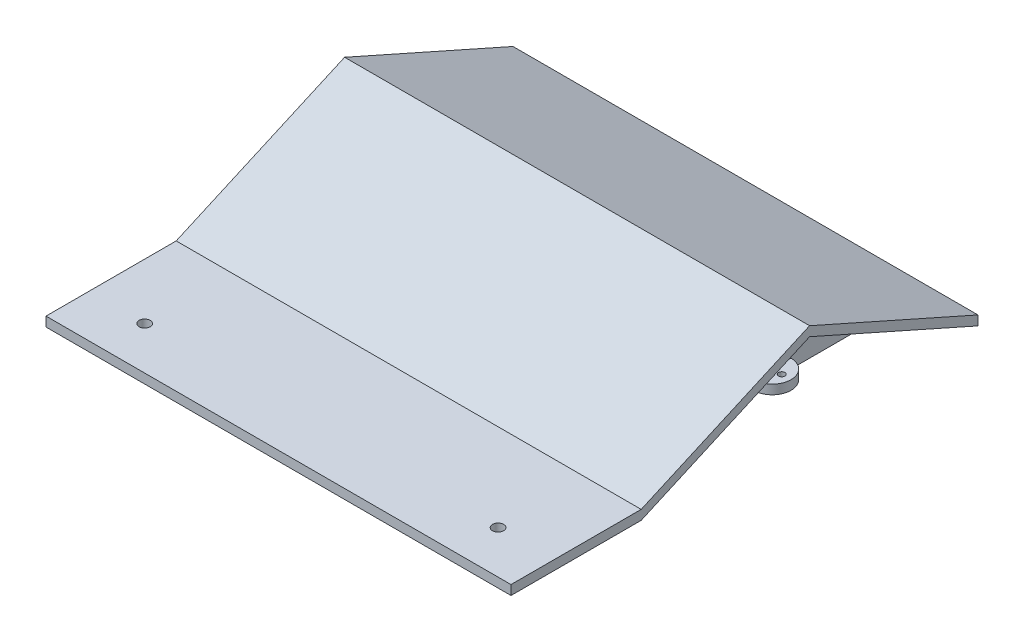
ISO-10303-21;
HEADER;
FILE_DESCRIPTION(('STEP AP214'),'2;1');
FILE_NAME('part.step','',(''),(''),'','','');
FILE_SCHEMA(('AUTOMOTIVE_DESIGN { 1 0 10303 214 1 1 1 1 }'));
ENDSEC;
DATA;
#1=APPLICATION_CONTEXT('core data for automotive mechanical design processes');
#2=APPLICATION_PROTOCOL_DEFINITION('international standard','automotive_design',2000,#1);
#3=PRODUCT_CONTEXT('',#1,'mechanical');
#4=PRODUCT('Part','Part','',(#3));
#5=PRODUCT_RELATED_PRODUCT_CATEGORY('part','',(#4));
#6=PRODUCT_DEFINITION_FORMATION('','',#4);
#7=PRODUCT_DEFINITION_CONTEXT('part definition',#1,'design');
#8=PRODUCT_DEFINITION('design','',#6,#7);
#9=PRODUCT_DEFINITION_SHAPE('','',#8);
#10=(LENGTH_UNIT() NAMED_UNIT(*) SI_UNIT(.MILLI.,.METRE.));
#11=(NAMED_UNIT(*) PLANE_ANGLE_UNIT() SI_UNIT($,.RADIAN.));
#12=(NAMED_UNIT(*) SI_UNIT($,.STERADIAN.) SOLID_ANGLE_UNIT());
#13=UNCERTAINTY_MEASURE_WITH_UNIT(LENGTH_MEASURE(1.E-05),#10,'distance_accuracy_value','');
#14=(GEOMETRIC_REPRESENTATION_CONTEXT(3) GLOBAL_UNCERTAINTY_ASSIGNED_CONTEXT((#13)) GLOBAL_UNIT_ASSIGNED_CONTEXT((#10,
#11,#12)) REPRESENTATION_CONTEXT('',''));
#15=CARTESIAN_POINT('',(0.,0.,0.));
#16=DIRECTION('',(0.,0.,1.));
#17=DIRECTION('',(1.,0.,0.));
#18=AXIS2_PLACEMENT_3D('',#15,#16,#17);
#19=CARTESIAN_POINT('',(-250.,4.27585831422593,1.9003814729893));
#20=DIRECTION('',(0.,-0.913811548620257,-0.406138466053448));
#21=DIRECTION('',(0.,0.406138466053448,-0.913811548620257));
#22=AXIS2_PLACEMENT_3D('',#19,#20,#21);
#23=PLANE('',#22);
#24=DIRECTION('',(0.,0.406138466053448,-0.913811548620257));
#25=VECTOR('',#24,1.);
#26=CARTESIAN_POINT('',(0.,4.27585831422593,1.9003814729893));
#27=LINE('',#26,#25);
#28=CARTESIAN_POINT('',(0.,-5.12047230222117,23.0421253599953));
#29=VERTEX_POINT('',#28);
#30=CARTESIAN_POINT('',(0.,35.1204723022212,-67.5));
#31=VERTEX_POINT('',#30);
#32=EDGE_CURVE('E209',#29,#31,#27,.T.);
#33=ORIENTED_EDGE('',*,*,#32,.T.);
#34=DIRECTION('',(1.,0.,0.));
#35=VECTOR('',#34,1.);
#36=CARTESIAN_POINT('',(-250.,35.1204723022212,-67.5));
#37=LINE('',#36,#35);
#38=CARTESIAN_POINT('',(-250.,35.1204723022212,-67.5));
#39=VERTEX_POINT('',#38);
#40=EDGE_CURVE('E430',#39,#31,#37,.T.);
#41=ORIENTED_EDGE('',*,*,#40,.F.);
#42=DIRECTION('',(0.,0.406138466053448,-0.913811548620257));
#43=VECTOR('',#42,1.);
#44=CARTESIAN_POINT('',(-250.,4.27585831422593,1.9003814729893));
#45=LINE('',#44,#43);
#46=CARTESIAN_POINT('',(-250.,-5.12047230222117,23.0421253599953));
#47=VERTEX_POINT('',#46);
#48=EDGE_CURVE('E400',#47,#39,#45,.T.);
#49=ORIENTED_EDGE('',*,*,#48,.F.);
#50=DIRECTION('',(1.,0.,0.));
#51=VECTOR('',#50,1.);
#52=CARTESIAN_POINT('',(-250.,-5.12047230222117,23.0421253599953));
#53=LINE('',#52,#51);
#54=EDGE_CURVE('E219',#47,#29,#53,.T.);
#55=ORIENTED_EDGE('',*,*,#54,.T.);
#56=EDGE_LOOP('',(#33,#41,#49,#55));
#57=FACE_BOUND('',#56,.T.);
#58=ADVANCED_FACE('F40',(#57),#23,.F.);
#59=CARTESIAN_POINT('',(-250.,54.3789510977311,-24.1684227101027));
#60=DIRECTION('',(0.,0.913811548620257,-0.406138466053448));
#61=DIRECTION('',(0.,0.406138466053448,0.913811548620257));
#62=AXIS2_PLACEMENT_3D('',#59,#60,#61);
#63=PLANE('',#62);
#64=DIRECTION('',(0.,0.406138466053448,0.913811548620257));
#65=VECTOR('',#64,1.);
#66=CARTESIAN_POINT('',(0.,54.3789510977311,-24.1684227101027));
#67=LINE('',#66,#65);
#68=CARTESIAN_POINT('',(0.,-5.12047230222117,-158.042125359995));
#69=VERTEX_POINT('',#68);
#70=EDGE_CURVE('E404',#69,#31,#67,.T.);
#71=ORIENTED_EDGE('',*,*,#70,.F.);
#72=DIRECTION('',(1.,0.,0.));
#73=VECTOR('',#72,1.);
#74=CARTESIAN_POINT('',(-250.,-5.12047230222117,-158.042125359995));
#75=LINE('',#74,#73);
#76=CARTESIAN_POINT('',(-250.,-5.12047230222117,-158.042125359995));
#77=VERTEX_POINT('',#76);
#78=EDGE_CURVE('E434',#77,#69,#75,.T.);
#79=ORIENTED_EDGE('',*,*,#78,.F.);
#80=DIRECTION('',(0.,0.406138466053448,0.913811548620257));
#81=VECTOR('',#80,1.);
#82=CARTESIAN_POINT('',(-250.,54.3789510977311,-24.1684227101027));
#83=LINE('',#82,#81);
#84=EDGE_CURVE('E414',#77,#39,#83,.T.);
#85=ORIENTED_EDGE('',*,*,#84,.T.);
#86=ORIENTED_EDGE('',*,*,#40,.T.);
#87=EDGE_LOOP('',(#71,#79,#85,#86));
#88=FACE_BOUND('',#87,.T.);
#89=ADVANCED_FACE('F497',(#88),#63,.T.);
#90=CARTESIAN_POINT('',(-250.,0.,-158.042125359995));
#91=DIRECTION('',(0.,0.,-1.));
#92=DIRECTION('',(-1.,0.,0.));
#93=AXIS2_PLACEMENT_3D('',#90,#91,#92);
#94=PLANE('',#93);
#95=DIRECTION('',(0.,1.,0.));
#96=VECTOR('',#95,1.);
#97=CARTESIAN_POINT('',(0.,0.,-158.042125359995));
#98=LINE('',#97,#96);
#99=CARTESIAN_POINT('',(0.,-10.2409446044423,-158.042125359995));
#100=VERTEX_POINT('',#99);
#101=EDGE_CURVE('E423',#100,#69,#98,.T.);
#102=ORIENTED_EDGE('',*,*,#101,.F.);
#103=DIRECTION('',(1.,0.,0.));
#104=VECTOR('',#103,1.);
#105=CARTESIAN_POINT('',(-250.,-10.2409446044423,-158.042125359995));
#106=LINE('',#105,#104);
#107=CARTESIAN_POINT('',(-250.,-10.2409446044423,-158.042125359995));
#108=VERTEX_POINT('',#107);
#109=EDGE_CURVE('E437',#108,#100,#106,.T.);
#110=ORIENTED_EDGE('',*,*,#109,.F.);
#111=DIRECTION('',(0.,1.,0.));
#112=VECTOR('',#111,1.);
#113=CARTESIAN_POINT('',(-250.,0.,-158.042125359995));
#114=LINE('',#113,#112);
#115=EDGE_CURVE('E410',#108,#77,#114,.T.);
#116=ORIENTED_EDGE('',*,*,#115,.T.);
#117=ORIENTED_EDGE('',*,*,#78,.T.);
#118=EDGE_LOOP('',(#102,#110,#116,#117));
#119=FACE_BOUND('',#118,.T.);
#120=ADVANCED_FACE('F503',(#119),#94,.T.);
#121=CARTESIAN_POINT('',(-250.,50.1030927835052,-22.2680412371134));
#122=DIRECTION('',(0.,-0.913811548620257,0.406138466053448));
#123=DIRECTION('',(0.,-0.406138466053448,-0.913811548620257));
#124=AXIS2_PLACEMENT_3D('',#121,#122,#123);
#125=PLANE('',#124);
#126=DIRECTION('',(-1.,0.,0.));
#127=VECTOR('',#126,1.);
#128=CARTESIAN_POINT('',(-225.,0.,-135.));
#129=LINE('',#128,#127);
#130=CARTESIAN_POINT('',(-225.,0.,-135.));
#131=VERTEX_POINT('',#130);
#132=CARTESIAN_POINT('',(-230.,0.,-135.));
#133=VERTEX_POINT('',#132);
#134=EDGE_CURVE('E359',#131,#133,#129,.T.);
#135=ORIENTED_EDGE('',*,*,#134,.T.);
#136=DIRECTION('',(-1.,0.,0.));
#137=VECTOR('',#136,1.);
#138=CARTESIAN_POINT('',(-230.,0.,-135.));
#139=LINE('',#138,#137);
#140=CARTESIAN_POINT('',(-250.,0.,-135.));
#141=VERTEX_POINT('',#140);
#142=EDGE_CURVE('E331',#133,#141,#139,.T.);
#143=ORIENTED_EDGE('',*,*,#142,.T.);
#144=DIRECTION('',(0.,-0.406138466053448,-0.913811548620257));
#145=VECTOR('',#144,1.);
#146=CARTESIAN_POINT('',(-250.,50.1030927835052,-22.2680412371134));
#147=LINE('',#146,#145);
#148=EDGE_CURVE('E407',#141,#108,#147,.T.);
#149=ORIENTED_EDGE('',*,*,#148,.T.);
#150=ORIENTED_EDGE('',*,*,#109,.T.);
#151=DIRECTION('',(0.,-0.406138466053448,-0.913811548620257));
#152=VECTOR('',#151,1.);
#153=CARTESIAN_POINT('',(0.,50.1030927835052,-22.2680412371134));
#154=LINE('',#153,#152);
#155=CARTESIAN_POINT('',(0.,29.9999999999999,-67.5));
#156=VERTEX_POINT('',#155);
#157=EDGE_CURVE('E208',#156,#100,#154,.T.);
#158=ORIENTED_EDGE('',*,*,#157,.F.);
#159=DIRECTION('',(1.,0.,0.));
#160=VECTOR('',#159,1.);
#161=CARTESIAN_POINT('',(-20.,29.9999999999999,-67.5));
#162=LINE('',#161,#160);
#163=CARTESIAN_POINT('',(-20.,29.9999999999999,-67.5));
#164=VERTEX_POINT('',#163);
#165=EDGE_CURVE('E203',#164,#156,#162,.T.);
#166=ORIENTED_EDGE('',*,*,#165,.F.);
#167=DIRECTION('',(0.,0.406138466053447,0.913811548620257));
#168=VECTOR('',#167,1.);
#169=CARTESIAN_POINT('',(-20.,0.,-135.));
#170=LINE('',#169,#168);
#171=CARTESIAN_POINT('',(-20.,0.,-135.));
#172=VERTEX_POINT('',#171);
#173=EDGE_CURVE('E374',#172,#164,#170,.T.);
#174=ORIENTED_EDGE('',*,*,#173,.F.);
#175=DIRECTION('',(1.,0.,0.));
#176=VECTOR('',#175,1.);
#177=CARTESIAN_POINT('',(-25.,0.,-135.));
#178=LINE('',#177,#176);
#179=CARTESIAN_POINT('',(-25.,0.,-135.));
#180=VERTEX_POINT('',#179);
#181=EDGE_CURVE('E393',#180,#172,#178,.T.);
#182=ORIENTED_EDGE('',*,*,#181,.F.);
#183=DIRECTION('',(0.,0.406138466053448,0.913811548620257));
#184=VECTOR('',#183,1.);
#185=CARTESIAN_POINT('',(-25.,0.,-135.));
#186=LINE('',#185,#184);
#187=CARTESIAN_POINT('',(-25.,30.,-67.5));
#188=VERTEX_POINT('',#187);
#189=EDGE_CURVE('E388',#180,#188,#186,.T.);
#190=ORIENTED_EDGE('',*,*,#189,.T.);
#191=DIRECTION('',(1.,0.,0.));
#192=VECTOR('',#191,1.);
#193=CARTESIAN_POINT('',(-250.,30.,-67.5));
#194=LINE('',#193,#192);
#195=CARTESIAN_POINT('',(-225.,30.,-67.5));
#196=VERTEX_POINT('',#195);
#197=EDGE_CURVE('E218',#196,#188,#194,.T.);
#198=ORIENTED_EDGE('',*,*,#197,.F.);
#199=DIRECTION('',(0.,-0.406138466053448,-0.913811548620257));
#200=VECTOR('',#199,1.);
#201=CARTESIAN_POINT('',(-225.,30.,-67.5));
#202=LINE('',#201,#200);
#203=EDGE_CURVE('E340',#196,#131,#202,.T.);
#204=ORIENTED_EDGE('',*,*,#203,.T.);
#205=EDGE_LOOP('',(#135,#143,#149,#150,#158,#166,#174,#182,#190,#198,#204));
#206=FACE_BOUND('',#205,.T.);
#207=ADVANCED_FACE('F505',(#206),#125,.T.);
#208=CARTESIAN_POINT('',(-250.,0.,0.));
#209=DIRECTION('',(0.,0.913811548620257,0.406138466053448));
#210=DIRECTION('',(0.,-0.406138466053448,0.913811548620257));
#211=AXIS2_PLACEMENT_3D('',#208,#209,#210);
#212=PLANE('',#211);
#213=DIRECTION('',(0.,-0.406138466053448,0.913811548620257));
#214=VECTOR('',#213,1.);
#215=CARTESIAN_POINT('',(-250.,0.,0.));
#216=LINE('',#215,#214);
#217=CARTESIAN_POINT('',(-250.,0.,0.));
#218=VERTEX_POINT('',#217);
#219=CARTESIAN_POINT('',(-250.,-10.2409446044423,23.0421253599953));
#220=VERTEX_POINT('',#219);
#221=EDGE_CURVE('E403',#218,#220,#216,.T.);
#222=ORIENTED_EDGE('',*,*,#221,.F.);
#223=DIRECTION('',(-1.,0.,0.));
#224=VECTOR('',#223,1.);
#225=CARTESIAN_POINT('',(-230.,0.,0.));
#226=LINE('',#225,#224);
#227=CARTESIAN_POINT('',(-230.,0.,0.));
#228=VERTEX_POINT('',#227);
#229=EDGE_CURVE('E341',#228,#218,#226,.T.);
#230=ORIENTED_EDGE('',*,*,#229,.F.);
#231=DIRECTION('',(-1.,0.,0.));
#232=VECTOR('',#231,1.);
#233=CARTESIAN_POINT('',(-225.,0.,0.));
#234=LINE('',#233,#232);
#235=CARTESIAN_POINT('',(-225.,0.,0.));
#236=VERTEX_POINT('',#235);
#237=EDGE_CURVE('E360',#236,#228,#234,.T.);
#238=ORIENTED_EDGE('',*,*,#237,.F.);
#239=DIRECTION('',(0.,0.406138466053448,-0.913811548620257));
#240=VECTOR('',#239,1.);
#241=CARTESIAN_POINT('',(-225.,0.,0.));
#242=LINE('',#241,#240);
#243=EDGE_CURVE('E355',#236,#196,#242,.T.);
#244=ORIENTED_EDGE('',*,*,#243,.T.);
#245=ORIENTED_EDGE('',*,*,#197,.T.);
#246=DIRECTION('',(0.,-0.406138466053448,0.913811548620257));
#247=VECTOR('',#246,1.);
#248=CARTESIAN_POINT('',(-25.,30.,-67.5));
#249=LINE('',#248,#247);
#250=CARTESIAN_POINT('',(-25.,0.,0.));
#251=VERTEX_POINT('',#250);
#252=EDGE_CURVE('E380',#188,#251,#249,.T.);
#253=ORIENTED_EDGE('',*,*,#252,.T.);
#254=DIRECTION('',(1.,0.,0.));
#255=VECTOR('',#254,1.);
#256=CARTESIAN_POINT('',(-25.,0.,0.));
#257=LINE('',#256,#255);
#258=CARTESIAN_POINT('',(-20.,0.,0.));
#259=VERTEX_POINT('',#258);
#260=EDGE_CURVE('E392',#251,#259,#257,.T.);
#261=ORIENTED_EDGE('',*,*,#260,.T.);
#262=DIRECTION('',(0.,-0.406138466053447,0.913811548620257));
#263=VECTOR('',#262,1.);
#264=CARTESIAN_POINT('',(-20.,29.9999999999999,-67.5));
#265=LINE('',#264,#263);
#266=EDGE_CURVE('E364',#164,#259,#265,.T.);
#267=ORIENTED_EDGE('',*,*,#266,.F.);
#268=ORIENTED_EDGE('',*,*,#165,.T.);
#269=DIRECTION('',(0.,-0.406138466053448,0.913811548620257));
#270=VECTOR('',#269,1.);
#271=CARTESIAN_POINT('',(0.,0.,0.));
#272=LINE('',#271,#270);
#273=CARTESIAN_POINT('',(0.,-10.2409446044423,23.0421253599953));
#274=VERTEX_POINT('',#273);
#275=EDGE_CURVE('E196',#156,#274,#272,.T.);
#276=ORIENTED_EDGE('',*,*,#275,.T.);
#277=DIRECTION('',(1.,0.,0.));
#278=VECTOR('',#277,1.);
#279=CARTESIAN_POINT('',(-250.,-10.2409446044423,23.0421253599953));
#280=LINE('',#279,#278);
#281=EDGE_CURVE('E200',#220,#274,#280,.T.);
#282=ORIENTED_EDGE('',*,*,#281,.F.);
#283=EDGE_LOOP('',(#222,#230,#238,#244,#245,#253,#261,#267,#268,#276,#282));
#284=FACE_BOUND('',#283,.T.);
#285=ADVANCED_FACE('F199',(#284),#212,.F.);
#286=CARTESIAN_POINT('',(-250.,0.,0.));
#287=DIRECTION('',(1.,0.,0.));
#288=DIRECTION('',(0.,0.,-1.));
#289=AXIS2_PLACEMENT_3D('',#286,#287,#288);
#290=PLANE('',#289);
#291=ORIENTED_EDGE('',*,*,#148,.F.);
#292=DIRECTION('',(0.,-0.401404468732289,-0.915900896648622));
#293=VECTOR('',#292,1.);
#294=CARTESIAN_POINT('',(-250.,29.5826783646268,-67.5));
#295=LINE('',#294,#293);
#296=CARTESIAN_POINT('',(-250.,29.5826783646268,-67.5));
#297=VERTEX_POINT('',#296);
#298=EDGE_CURVE('E318',#297,#141,#295,.T.);
#299=ORIENTED_EDGE('',*,*,#298,.F.);
#300=DIRECTION('',(0.,0.401404468732289,-0.915900896648622));
#301=VECTOR('',#300,1.);
#302=CARTESIAN_POINT('',(-250.,0.,0.));
#303=LINE('',#302,#301);
#304=EDGE_CURVE('E323',#218,#297,#303,.T.);
#305=ORIENTED_EDGE('',*,*,#304,.F.);
#306=ORIENTED_EDGE('',*,*,#221,.T.);
#307=DIRECTION('',(0.,0.,1.));
#308=VECTOR('',#307,1.);
#309=CARTESIAN_POINT('',(-250.,-10.2409446044423,93.0421253599953));
#310=LINE('',#309,#308);
#311=CARTESIAN_POINT('',(-250.,-10.2409446044423,93.0421253599953));
#312=VERTEX_POINT('',#311);
#313=EDGE_CURVE('E216',#220,#312,#310,.T.);
#314=ORIENTED_EDGE('',*,*,#313,.T.);
#315=DIRECTION('',(0.,1.,0.));
#316=VECTOR('',#315,1.);
#317=CARTESIAN_POINT('',(-250.,-5.12047230222117,93.0421253599953));
#318=LINE('',#317,#316);
#319=CARTESIAN_POINT('',(-250.,-5.12047230222117,93.0421253599953));
#320=VERTEX_POINT('',#319);
#321=EDGE_CURVE('E234',#312,#320,#318,.T.);
#322=ORIENTED_EDGE('',*,*,#321,.T.);
#323=DIRECTION('',(0.,0.,-1.));
#324=VECTOR('',#323,1.);
#325=CARTESIAN_POINT('',(-250.,-5.12047230222117,23.0421253599953));
#326=LINE('',#325,#324);
#327=EDGE_CURVE('E227',#320,#47,#326,.T.);
#328=ORIENTED_EDGE('',*,*,#327,.T.);
#329=ORIENTED_EDGE('',*,*,#48,.T.);
#330=ORIENTED_EDGE('',*,*,#84,.F.);
#331=ORIENTED_EDGE('',*,*,#115,.F.);
#332=EDGE_LOOP('',(#291,#299,#305,#306,#314,#322,#328,#329,#330,#331));
#333=FACE_BOUND('',#332,.T.);
#334=ADVANCED_FACE('F488',(#333),#290,.F.);
#335=CARTESIAN_POINT('',(0.,0.,0.));
#336=DIRECTION('',(1.,0.,0.));
#337=DIRECTION('',(0.,0.,-1.));
#338=AXIS2_PLACEMENT_3D('',#335,#336,#337);
#339=PLANE('',#338);
#340=ORIENTED_EDGE('',*,*,#275,.F.);
#341=ORIENTED_EDGE('',*,*,#157,.T.);
#342=ORIENTED_EDGE('',*,*,#101,.T.);
#343=ORIENTED_EDGE('',*,*,#70,.T.);
#344=ORIENTED_EDGE('',*,*,#32,.F.);
#345=DIRECTION('',(0.,0.,-1.));
#346=VECTOR('',#345,1.);
#347=CARTESIAN_POINT('',(0.,-5.12047230222117,23.0421253599953));
#348=LINE('',#347,#346);
#349=CARTESIAN_POINT('',(0.,-5.12047230222117,93.0421253599953));
#350=VERTEX_POINT('',#349);
#351=EDGE_CURVE('E231',#350,#29,#348,.T.);
#352=ORIENTED_EDGE('',*,*,#351,.F.);
#353=DIRECTION('',(0.,1.,0.));
#354=VECTOR('',#353,1.);
#355=CARTESIAN_POINT('',(0.,-5.12047230222117,93.0421253599953));
#356=LINE('',#355,#354);
#357=CARTESIAN_POINT('',(0.,-10.2409446044423,93.0421253599953));
#358=VERTEX_POINT('',#357);
#359=EDGE_CURVE('E225',#358,#350,#356,.T.);
#360=ORIENTED_EDGE('',*,*,#359,.F.);
#361=DIRECTION('',(0.,0.,1.));
#362=VECTOR('',#361,1.);
#363=CARTESIAN_POINT('',(0.,-10.2409446044423,93.0421253599953));
#364=LINE('',#363,#362);
#365=EDGE_CURVE('E214',#274,#358,#364,.T.);
#366=ORIENTED_EDGE('',*,*,#365,.F.);
#367=EDGE_LOOP('',(#340,#341,#342,#343,#344,#352,#360,#366));
#368=FACE_BOUND('',#367,.T.);
#369=ADVANCED_FACE('F222',(#368),#339,.T.);
#370=CARTESIAN_POINT('',(-25.,0.,0.));
#371=DIRECTION('',(0.,-1.,0.));
#372=DIRECTION('',(0.,0.,-1.));
#373=AXIS2_PLACEMENT_3D('',#370,#371,#372);
#374=PLANE('',#373);
#375=DIRECTION('',(0.,0.,-1.));
#376=VECTOR('',#375,1.);
#377=CARTESIAN_POINT('',(-20.,0.,0.));
#378=LINE('',#377,#376);
#379=CARTESIAN_POINT('',(-20.,0.,-77.5));
#380=VERTEX_POINT('',#379);
#381=EDGE_CURVE('E370',#380,#172,#378,.T.);
#382=ORIENTED_EDGE('',*,*,#381,.F.);
#383=CARTESIAN_POINT('',(-20.,0.,-67.5));
#384=DIRECTION('',(0.,-1.,0.));
#385=DIRECTION('',(0.,0.,-1.));
#386=AXIS2_PLACEMENT_3D('',#383,#384,#385);
#387=CIRCLE('',#386,10.);
#388=CARTESIAN_POINT('',(-20.,0.,-57.5));
#389=VERTEX_POINT('',#388);
#390=EDGE_CURVE('E272',#380,#389,#387,.T.);
#391=ORIENTED_EDGE('',*,*,#390,.T.);
#392=EDGE_CURVE('E371',#259,#389,#378,.T.);
#393=ORIENTED_EDGE('',*,*,#392,.F.);
#394=ORIENTED_EDGE('',*,*,#260,.F.);
#395=DIRECTION('',(0.,0.,-1.));
#396=VECTOR('',#395,1.);
#397=CARTESIAN_POINT('',(-25.,0.,0.));
#398=LINE('',#397,#396);
#399=CARTESIAN_POINT('',(-25.,0.,-58.8397459621556));
#400=VERTEX_POINT('',#399);
#401=EDGE_CURVE('E385',#251,#400,#398,.T.);
#402=ORIENTED_EDGE('',*,*,#401,.T.);
#403=CARTESIAN_POINT('',(-25.,0.,-76.1602540378444));
#404=VERTEX_POINT('',#403);
#405=EDGE_CURVE('E57',#400,#404,#387,.T.);
#406=ORIENTED_EDGE('',*,*,#405,.T.);
#407=EDGE_CURVE('E384',#404,#180,#398,.T.);
#408=ORIENTED_EDGE('',*,*,#407,.T.);
#409=ORIENTED_EDGE('',*,*,#181,.T.);
#410=EDGE_LOOP('',(#382,#391,#393,#394,#402,#406,#408,#409));
#411=FACE_BOUND('',#410,.T.);
#412=CARTESIAN_POINT('',(-15.,0.,-67.5));
#413=DIRECTION('',(0.,-1.,0.));
#414=DIRECTION('',(0.,0.,-1.));
#415=AXIS2_PLACEMENT_3D('',#412,#413,#414);
#416=CIRCLE('',#415,1.7);
#417=CARTESIAN_POINT('',(-15.,0.,-69.2));
#418=VERTEX_POINT('',#417);
#419=EDGE_CURVE('E276',#418,#418,#416,.T.);
#420=ORIENTED_EDGE('',*,*,#419,.F.);
#421=EDGE_LOOP('',(#420));
#422=FACE_BOUND('',#421,.T.);
#423=ADVANCED_FACE('F550',(#411,#422),#374,.T.);
#424=CARTESIAN_POINT('',(-25.,0.,0.));
#425=DIRECTION('',(-1.,0.,0.));
#426=DIRECTION('',(0.,0.,1.));
#427=AXIS2_PLACEMENT_3D('',#424,#425,#426);
#428=PLANE('',#427);
#429=DIRECTION('',(0.,-1.,0.));
#430=VECTOR('',#429,1.);
#431=CARTESIAN_POINT('',(-25.,5.00000000000001,-76.1602540378444));
#432=LINE('',#431,#430);
#433=CARTESIAN_POINT('',(-25.,5.00000000000001,-76.1602540378444));
#434=VERTEX_POINT('',#433);
#435=EDGE_CURVE('E286',#434,#404,#432,.T.);
#436=ORIENTED_EDGE('',*,*,#435,.F.);
#437=DIRECTION('',(0.,0.,1.));
#438=VECTOR('',#437,1.);
#439=CARTESIAN_POINT('',(-25.,5.,0.));
#440=LINE('',#439,#438);
#441=CARTESIAN_POINT('',(-25.,5.,-58.8397459621556));
#442=VERTEX_POINT('',#441);
#443=EDGE_CURVE('E271',#434,#442,#440,.T.);
#444=ORIENTED_EDGE('',*,*,#443,.T.);
#445=DIRECTION('',(0.,-1.,0.));
#446=VECTOR('',#445,1.);
#447=CARTESIAN_POINT('',(-25.,5.,-58.8397459621556));
#448=LINE('',#447,#446);
#449=EDGE_CURVE('E283',#400,#442,#448,.F.);
#450=ORIENTED_EDGE('',*,*,#449,.F.);
#451=ORIENTED_EDGE('',*,*,#401,.F.);
#452=ORIENTED_EDGE('',*,*,#252,.F.);
#453=ORIENTED_EDGE('',*,*,#189,.F.);
#454=ORIENTED_EDGE('',*,*,#407,.F.);
#455=EDGE_LOOP('',(#436,#444,#450,#451,#452,#453,#454));
#456=FACE_BOUND('',#455,.T.);
#457=ADVANCED_FACE('F546',(#456),#428,.T.);
#458=CARTESIAN_POINT('',(-20.,0.,0.));
#459=DIRECTION('',(-1.,0.,0.));
#460=DIRECTION('',(0.,0.,1.));
#461=AXIS2_PLACEMENT_3D('',#458,#459,#460);
#462=PLANE('',#461);
#463=DIRECTION('',(0.,0.,1.));
#464=VECTOR('',#463,1.);
#465=CARTESIAN_POINT('',(-20.,5.,0.));
#466=LINE('',#465,#464);
#467=CARTESIAN_POINT('',(-20.,5.00000000000001,-77.5));
#468=VERTEX_POINT('',#467);
#469=CARTESIAN_POINT('',(-20.,5.,-57.5));
#470=VERTEX_POINT('',#469);
#471=EDGE_CURVE('E455',#468,#470,#466,.T.);
#472=ORIENTED_EDGE('',*,*,#471,.F.);
#473=DIRECTION('',(0.,-1.,0.));
#474=VECTOR('',#473,1.);
#475=CARTESIAN_POINT('',(-20.,5.00000000000001,-77.5));
#476=LINE('',#475,#474);
#477=EDGE_CURVE('E11',#468,#380,#476,.T.);
#478=ORIENTED_EDGE('',*,*,#477,.T.);
#479=ORIENTED_EDGE('',*,*,#381,.T.);
#480=ORIENTED_EDGE('',*,*,#173,.T.);
#481=ORIENTED_EDGE('',*,*,#266,.T.);
#482=ORIENTED_EDGE('',*,*,#392,.T.);
#483=DIRECTION('',(0.,-1.,0.));
#484=VECTOR('',#483,1.);
#485=CARTESIAN_POINT('',(-20.,5.,-57.5));
#486=LINE('',#485,#484);
#487=EDGE_CURVE('E49',#389,#470,#486,.F.);
#488=ORIENTED_EDGE('',*,*,#487,.T.);
#489=EDGE_LOOP('',(#472,#478,#479,#480,#481,#482,#488));
#490=FACE_BOUND('',#489,.T.);
#491=ADVANCED_FACE('F553',(#490),#462,.F.);
#492=CARTESIAN_POINT('',(-225.,0.,-135.));
#493=DIRECTION('',(0.,-1.,0.));
#494=DIRECTION('',(0.,0.,-1.));
#495=AXIS2_PLACEMENT_3D('',#492,#493,#494);
#496=PLANE('',#495);
#497=DIRECTION('',(0.,0.,1.));
#498=VECTOR('',#497,1.);
#499=CARTESIAN_POINT('',(-230.,0.,-135.));
#500=LINE('',#499,#498);
#501=CARTESIAN_POINT('',(-230.,0.,-57.5));
#502=VERTEX_POINT('',#501);
#503=EDGE_CURVE('E322',#502,#228,#500,.T.);
#504=ORIENTED_EDGE('',*,*,#503,.F.);
#505=CARTESIAN_POINT('',(-230.,0.,-67.5));
#506=DIRECTION('',(0.,-1.,0.));
#507=DIRECTION('',(0.,0.,-1.));
#508=AXIS2_PLACEMENT_3D('',#505,#506,#507);
#509=CIRCLE('',#508,10.);
#510=CARTESIAN_POINT('',(-230.,0.,-77.5));
#511=VERTEX_POINT('',#510);
#512=EDGE_CURVE('E289',#502,#511,#509,.T.);
#513=ORIENTED_EDGE('',*,*,#512,.T.);
#514=EDGE_CURVE('E324',#133,#511,#500,.T.);
#515=ORIENTED_EDGE('',*,*,#514,.F.);
#516=ORIENTED_EDGE('',*,*,#134,.F.);
#517=DIRECTION('',(0.,0.,1.));
#518=VECTOR('',#517,1.);
#519=CARTESIAN_POINT('',(-225.,0.,-135.));
#520=LINE('',#519,#518);
#521=CARTESIAN_POINT('',(-225.,0.,-76.1602540378444));
#522=VERTEX_POINT('',#521);
#523=EDGE_CURVE('E351',#131,#522,#520,.T.);
#524=ORIENTED_EDGE('',*,*,#523,.T.);
#525=CARTESIAN_POINT('',(-225.,0.,-58.8397459621556));
#526=VERTEX_POINT('',#525);
#527=EDGE_CURVE('E304',#522,#526,#509,.T.);
#528=ORIENTED_EDGE('',*,*,#527,.T.);
#529=EDGE_CURVE('E350',#526,#236,#520,.T.);
#530=ORIENTED_EDGE('',*,*,#529,.T.);
#531=ORIENTED_EDGE('',*,*,#237,.T.);
#532=EDGE_LOOP('',(#504,#513,#515,#516,#524,#528,#530,#531));
#533=FACE_BOUND('',#532,.T.);
#534=CARTESIAN_POINT('',(-235.,0.,-67.5));
#535=DIRECTION('',(0.,-1.,0.));
#536=DIRECTION('',(0.,0.,-1.));
#537=AXIS2_PLACEMENT_3D('',#534,#535,#536);
#538=CIRCLE('',#537,1.70000000000001);
#539=CARTESIAN_POINT('',(-235.,0.,-69.2));
#540=VERTEX_POINT('',#539);
#541=EDGE_CURVE('E295',#540,#540,#538,.T.);
#542=ORIENTED_EDGE('',*,*,#541,.F.);
#543=EDGE_LOOP('',(#542));
#544=FACE_BOUND('',#543,.T.);
#545=ADVANCED_FACE('F512',(#533,#544),#496,.T.);
#546=CARTESIAN_POINT('',(-225.,0.,0.));
#547=DIRECTION('',(1.,0.,0.));
#548=DIRECTION('',(0.,0.,-1.));
#549=AXIS2_PLACEMENT_3D('',#546,#547,#548);
#550=PLANE('',#549);
#551=CARTESIAN_POINT('',(-225.,25.,-67.5));
#552=DIRECTION('',(1.,0.,0.));
#553=DIRECTION('',(0.,0.,-1.));
#554=AXIS2_PLACEMENT_3D('',#551,#552,#553);
#555=CIRCLE('',#554,1.5);
#556=CARTESIAN_POINT('',(-225.,25.,-69.));
#557=VERTEX_POINT('',#556);
#558=EDGE_CURVE('E258',#557,#557,#555,.T.);
#559=ORIENTED_EDGE('',*,*,#558,.F.);
#560=EDGE_LOOP('',(#559));
#561=FACE_BOUND('',#560,.T.);
#562=DIRECTION('',(0.,-1.,0.));
#563=VECTOR('',#562,1.);
#564=CARTESIAN_POINT('',(-225.,5.,-58.8397459621556));
#565=LINE('',#564,#563);
#566=CARTESIAN_POINT('',(-225.,5.,-58.8397459621556));
#567=VERTEX_POINT('',#566);
#568=EDGE_CURVE('E314',#567,#526,#565,.T.);
#569=ORIENTED_EDGE('',*,*,#568,.F.);
#570=DIRECTION('',(0.,0.,-1.));
#571=VECTOR('',#570,1.);
#572=CARTESIAN_POINT('',(-225.,5.,0.));
#573=LINE('',#572,#571);
#574=CARTESIAN_POINT('',(-225.,5.00000000000001,-76.1602540378444));
#575=VERTEX_POINT('',#574);
#576=EDGE_CURVE('E300',#567,#575,#573,.T.);
#577=ORIENTED_EDGE('',*,*,#576,.T.);
#578=DIRECTION('',(0.,-1.,0.));
#579=VECTOR('',#578,1.);
#580=CARTESIAN_POINT('',(-225.,5.00000000000001,-76.1602540378444));
#581=LINE('',#580,#579);
#582=EDGE_CURVE('E311',#522,#575,#581,.F.);
#583=ORIENTED_EDGE('',*,*,#582,.F.);
#584=ORIENTED_EDGE('',*,*,#523,.F.);
#585=ORIENTED_EDGE('',*,*,#203,.F.);
#586=ORIENTED_EDGE('',*,*,#243,.F.);
#587=ORIENTED_EDGE('',*,*,#529,.F.);
#588=EDGE_LOOP('',(#569,#577,#583,#584,#585,#586,#587));
#589=FACE_BOUND('',#588,.T.);
#590=ADVANCED_FACE('F537',(#561,#589),#550,.T.);
#591=CARTESIAN_POINT('',(-230.,29.5826783646268,-67.5));
#592=DIRECTION('',(0.,0.915900896648622,-0.401404468732289));
#593=DIRECTION('',(0.,0.401404468732289,0.915900896648622));
#594=AXIS2_PLACEMENT_3D('',#591,#592,#593);
#595=PLANE('',#594);
#596=ORIENTED_EDGE('',*,*,#298,.T.);
#597=ORIENTED_EDGE('',*,*,#142,.F.);
#598=DIRECTION('',(0.,-0.401404468732289,-0.915900896648622));
#599=VECTOR('',#598,1.);
#600=CARTESIAN_POINT('',(-230.,29.5826783646268,-67.5));
#601=LINE('',#600,#599);
#602=CARTESIAN_POINT('',(-230.,29.5826783646268,-67.5));
#603=VERTEX_POINT('',#602);
#604=EDGE_CURVE('E319',#603,#133,#601,.T.);
#605=ORIENTED_EDGE('',*,*,#604,.F.);
#606=DIRECTION('',(-1.,0.,0.));
#607=VECTOR('',#606,1.);
#608=CARTESIAN_POINT('',(-230.,29.5826783646268,-67.5));
#609=LINE('',#608,#607);
#610=EDGE_CURVE('E337',#603,#297,#609,.T.);
#611=ORIENTED_EDGE('',*,*,#610,.T.);
#612=EDGE_LOOP('',(#596,#597,#605,#611));
#613=FACE_BOUND('',#612,.T.);
#614=ADVANCED_FACE('F510',(#613),#595,.F.);
#615=CARTESIAN_POINT('',(-230.,0.,0.));
#616=DIRECTION('',(0.,0.915900896648622,0.401404468732289));
#617=DIRECTION('',(0.,-0.401404468732289,0.915900896648622));
#618=AXIS2_PLACEMENT_3D('',#615,#616,#617);
#619=PLANE('',#618);
#620=ORIENTED_EDGE('',*,*,#304,.T.);
#621=ORIENTED_EDGE('',*,*,#610,.F.);
#622=DIRECTION('',(0.,0.401404468732289,-0.915900896648622));
#623=VECTOR('',#622,1.);
#624=CARTESIAN_POINT('',(-230.,0.,0.));
#625=LINE('',#624,#623);
#626=EDGE_CURVE('E327',#228,#603,#625,.T.);
#627=ORIENTED_EDGE('',*,*,#626,.F.);
#628=ORIENTED_EDGE('',*,*,#229,.T.);
#629=EDGE_LOOP('',(#620,#621,#627,#628));
#630=FACE_BOUND('',#629,.T.);
#631=ADVANCED_FACE('F529',(#630),#619,.F.);
#632=CARTESIAN_POINT('',(-230.,0.,0.));
#633=DIRECTION('',(1.,0.,0.));
#634=DIRECTION('',(0.,0.,-1.));
#635=AXIS2_PLACEMENT_3D('',#632,#633,#634);
#636=PLANE('',#635);
#637=CARTESIAN_POINT('',(-230.,25.,-67.5));
#638=DIRECTION('',(-1.,0.,0.));
#639=DIRECTION('',(0.,0.,1.));
#640=AXIS2_PLACEMENT_3D('',#637,#638,#639);
#641=CIRCLE('',#640,1.5);
#642=CARTESIAN_POINT('',(-230.,25.,-66.));
#643=VERTEX_POINT('',#642);
#644=EDGE_CURVE('E252',#643,#643,#641,.T.);
#645=ORIENTED_EDGE('',*,*,#644,.F.);
#646=EDGE_LOOP('',(#645));
#647=FACE_BOUND('',#646,.T.);
#648=DIRECTION('',(0.,0.,-1.));
#649=VECTOR('',#648,1.);
#650=CARTESIAN_POINT('',(-230.,5.,0.));
#651=LINE('',#650,#649);
#652=CARTESIAN_POINT('',(-230.,5.,-57.5));
#653=VERTEX_POINT('',#652);
#654=CARTESIAN_POINT('',(-230.,5.00000000000001,-77.5));
#655=VERTEX_POINT('',#654);
#656=EDGE_CURVE('E433',#653,#655,#651,.T.);
#657=ORIENTED_EDGE('',*,*,#656,.F.);
#658=DIRECTION('',(0.,-1.,0.));
#659=VECTOR('',#658,1.);
#660=CARTESIAN_POINT('',(-230.,5.,-57.5));
#661=LINE('',#660,#659);
#662=EDGE_CURVE('E451',#653,#502,#661,.T.);
#663=ORIENTED_EDGE('',*,*,#662,.T.);
#664=ORIENTED_EDGE('',*,*,#503,.T.);
#665=ORIENTED_EDGE('',*,*,#626,.T.);
#666=ORIENTED_EDGE('',*,*,#604,.T.);
#667=ORIENTED_EDGE('',*,*,#514,.T.);
#668=DIRECTION('',(0.,-1.,0.));
#669=VECTOR('',#668,1.);
#670=CARTESIAN_POINT('',(-230.,5.00000000000001,-77.5));
#671=LINE('',#670,#669);
#672=EDGE_CURVE('E448',#511,#655,#671,.F.);
#673=ORIENTED_EDGE('',*,*,#672,.T.);
#674=EDGE_LOOP('',(#657,#663,#664,#665,#666,#667,#673));
#675=FACE_BOUND('',#674,.T.);
#676=ADVANCED_FACE('F518',(#647,#675),#636,.F.);
#677=CARTESIAN_POINT('',(-235.,5.00000000000001,-67.5));
#678=DIRECTION('',(0.,-1.,0.));
#679=DIRECTION('',(0.,0.,-1.));
#680=AXIS2_PLACEMENT_3D('',#677,#678,#679);
#681=CYLINDRICAL_SURFACE('',#680,1.70000000000001);
#682=CARTESIAN_POINT('',(-235.,5.00000000000001,-67.5));
#683=DIRECTION('',(0.,-1.,0.));
#684=DIRECTION('',(0.,0.,-1.));
#685=AXIS2_PLACEMENT_3D('',#682,#683,#684);
#686=CIRCLE('',#685,1.70000000000001);
#687=CARTESIAN_POINT('',(-235.,5.00000000000001,-69.2));
#688=VERTEX_POINT('',#687);
#689=EDGE_CURVE('E296',#688,#688,#686,.T.);
#690=ORIENTED_EDGE('',*,*,#689,.F.);
#691=EDGE_LOOP('',(#690));
#692=FACE_BOUND('',#691,.T.);
#693=ORIENTED_EDGE('',*,*,#541,.T.);
#694=EDGE_LOOP('',(#693));
#695=FACE_BOUND('',#694,.T.);
#696=ADVANCED_FACE('F625',(#692,#695),#681,.F.);
#697=CARTESIAN_POINT('',(0.,5.,0.));
#698=DIRECTION('',(0.,-1.,0.));
#699=DIRECTION('',(0.,0.,-1.));
#700=AXIS2_PLACEMENT_3D('',#697,#698,#699);
#701=PLANE('',#700);
#702=ORIENTED_EDGE('',*,*,#689,.T.);
#703=EDGE_LOOP('',(#702));
#704=FACE_BOUND('',#703,.T.);
#705=CARTESIAN_POINT('',(-230.,5.00000000000001,-67.5));
#706=DIRECTION('',(0.,-1.,0.));
#707=DIRECTION('',(0.,0.,-1.));
#708=AXIS2_PLACEMENT_3D('',#705,#706,#707);
#709=CIRCLE('',#708,10.);
#710=EDGE_CURVE('E290',#653,#655,#709,.T.);
#711=ORIENTED_EDGE('',*,*,#710,.F.);
#712=ORIENTED_EDGE('',*,*,#656,.T.);
#713=EDGE_LOOP('',(#711,#712));
#714=FACE_BOUND('',#713,.T.);
#715=ADVANCED_FACE('F524',(#704,#714),#701,.F.);
#716=CARTESIAN_POINT('',(-230.,5.00000000000001,-67.5));
#717=DIRECTION('',(0.,-1.,0.));
#718=DIRECTION('',(0.,0.,-1.));
#719=AXIS2_PLACEMENT_3D('',#716,#717,#718);
#720=CYLINDRICAL_SURFACE('',#719,10.);
#721=ORIENTED_EDGE('',*,*,#662,.F.);
#722=ORIENTED_EDGE('',*,*,#710,.T.);
#723=ORIENTED_EDGE('',*,*,#672,.F.);
#724=ORIENTED_EDGE('',*,*,#512,.F.);
#725=EDGE_LOOP('',(#721,#722,#723,#724));
#726=FACE_BOUND('',#725,.T.);
#727=ADVANCED_FACE('F521',(#726),#720,.T.);
#728=EDGE_CURVE('E294',#575,#567,#709,.T.);
#729=ORIENTED_EDGE('',*,*,#728,.T.);
#730=ORIENTED_EDGE('',*,*,#568,.T.);
#731=ORIENTED_EDGE('',*,*,#527,.F.);
#732=ORIENTED_EDGE('',*,*,#582,.T.);
#733=EDGE_LOOP('',(#729,#730,#731,#732));
#734=FACE_BOUND('',#733,.T.);
#735=ADVANCED_FACE('F627',(#734),#720,.T.);
#736=ORIENTED_EDGE('',*,*,#576,.F.);
#737=ORIENTED_EDGE('',*,*,#728,.F.);
#738=EDGE_LOOP('',(#736,#737));
#739=FACE_BOUND('',#738,.T.);
#740=ADVANCED_FACE('F630',(#739),#701,.F.);
#741=CARTESIAN_POINT('',(-15.,5.,-67.5));
#742=DIRECTION('',(0.,-1.,0.));
#743=DIRECTION('',(0.,0.,-1.));
#744=AXIS2_PLACEMENT_3D('',#741,#742,#743);
#745=CYLINDRICAL_SURFACE('',#744,1.7);
#746=CARTESIAN_POINT('',(-15.,5.,-67.5));
#747=DIRECTION('',(0.,-1.,0.));
#748=DIRECTION('',(0.,0.,-1.));
#749=AXIS2_PLACEMENT_3D('',#746,#747,#748);
#750=CIRCLE('',#749,1.7);
#751=CARTESIAN_POINT('',(-15.,5.,-69.2));
#752=VERTEX_POINT('',#751);
#753=EDGE_CURVE('E266',#752,#752,#750,.T.);
#754=ORIENTED_EDGE('',*,*,#753,.F.);
#755=EDGE_LOOP('',(#754));
#756=FACE_BOUND('',#755,.T.);
#757=ORIENTED_EDGE('',*,*,#419,.T.);
#758=EDGE_LOOP('',(#757));
#759=FACE_BOUND('',#758,.T.);
#760=ADVANCED_FACE('F585',(#756,#759),#745,.F.);
#761=CARTESIAN_POINT('',(0.,5.,0.));
#762=DIRECTION('',(0.,-1.,0.));
#763=DIRECTION('',(0.,0.,-1.));
#764=AXIS2_PLACEMENT_3D('',#761,#762,#763);
#765=PLANE('',#764);
#766=ORIENTED_EDGE('',*,*,#753,.T.);
#767=EDGE_LOOP('',(#766));
#768=FACE_BOUND('',#767,.T.);
#769=CARTESIAN_POINT('',(-20.,5.,-67.5));
#770=DIRECTION('',(0.,-1.,0.));
#771=DIRECTION('',(0.,0.,-1.));
#772=AXIS2_PLACEMENT_3D('',#769,#770,#771);
#773=CIRCLE('',#772,10.);
#774=EDGE_CURVE('E262',#468,#470,#773,.T.);
#775=ORIENTED_EDGE('',*,*,#774,.F.);
#776=ORIENTED_EDGE('',*,*,#471,.T.);
#777=EDGE_LOOP('',(#775,#776));
#778=FACE_BOUND('',#777,.T.);
#779=ADVANCED_FACE('F559',(#768,#778),#765,.F.);
#780=CARTESIAN_POINT('',(-20.,5.,-67.5));
#781=DIRECTION('',(0.,-1.,0.));
#782=DIRECTION('',(0.,0.,-1.));
#783=AXIS2_PLACEMENT_3D('',#780,#781,#782);
#784=CYLINDRICAL_SURFACE('',#783,10.);
#785=ORIENTED_EDGE('',*,*,#477,.F.);
#786=ORIENTED_EDGE('',*,*,#774,.T.);
#787=ORIENTED_EDGE('',*,*,#487,.F.);
#788=ORIENTED_EDGE('',*,*,#390,.F.);
#789=EDGE_LOOP('',(#785,#786,#787,#788));
#790=FACE_BOUND('',#789,.T.);
#791=ADVANCED_FACE('F556',(#790),#784,.T.);
#792=EDGE_CURVE('E267',#442,#434,#773,.T.);
#793=ORIENTED_EDGE('',*,*,#792,.T.);
#794=ORIENTED_EDGE('',*,*,#435,.T.);
#795=ORIENTED_EDGE('',*,*,#405,.F.);
#796=ORIENTED_EDGE('',*,*,#449,.T.);
#797=EDGE_LOOP('',(#793,#794,#795,#796));
#798=FACE_BOUND('',#797,.T.);
#799=ADVANCED_FACE('F570',(#798),#784,.T.);
#800=ORIENTED_EDGE('',*,*,#443,.F.);
#801=ORIENTED_EDGE('',*,*,#792,.F.);
#802=EDGE_LOOP('',(#800,#801));
#803=FACE_BOUND('',#802,.T.);
#804=ADVANCED_FACE('F572',(#803),#765,.F.);
#805=CARTESIAN_POINT('',(-220.,25.,-67.5));
#806=DIRECTION('',(-1.,0.,0.));
#807=DIRECTION('',(0.,0.,1.));
#808=AXIS2_PLACEMENT_3D('',#805,#806,#807);
#809=CYLINDRICAL_SURFACE('',#808,1.5);
#810=ORIENTED_EDGE('',*,*,#558,.T.);
#811=EDGE_LOOP('',(#810));
#812=FACE_BOUND('',#811,.T.);
#813=ORIENTED_EDGE('',*,*,#644,.T.);
#814=EDGE_LOOP('',(#813));
#815=FACE_BOUND('',#814,.T.);
#816=ADVANCED_FACE('F481',(#812,#815),#809,.F.);
#817=CARTESIAN_POINT('',(0.,-5.12047230222117,23.0421253599953));
#818=DIRECTION('',(0.,1.,0.));
#819=DIRECTION('',(0.,0.,1.));
#820=AXIS2_PLACEMENT_3D('',#817,#818,#819);
#821=PLANE('',#820);
#822=CARTESIAN_POINT('',(-220.,-5.12047230222117,70.));
#823=DIRECTION('',(0.,1.,0.));
#824=DIRECTION('',(0.,0.,1.));
#825=AXIS2_PLACEMENT_3D('',#822,#823,#824);
#826=CIRCLE('',#825,2.99999999999999);
#827=CARTESIAN_POINT('',(-220.,-5.12047230222117,73.));
#828=VERTEX_POINT('',#827);
#829=EDGE_CURVE('E462',#828,#828,#826,.T.);
#830=ORIENTED_EDGE('',*,*,#829,.F.);
#831=EDGE_LOOP('',(#830));
#832=FACE_BOUND('',#831,.T.);
#833=CARTESIAN_POINT('',(-30.,-5.12047230222117,70.));
#834=DIRECTION('',(0.,1.,0.));
#835=DIRECTION('',(0.,0.,1.));
#836=AXIS2_PLACEMENT_3D('',#833,#834,#835);
#837=CIRCLE('',#836,3.);
#838=CARTESIAN_POINT('',(-30.,-5.12047230222117,73.));
#839=VERTEX_POINT('',#838);
#840=EDGE_CURVE('E237',#839,#839,#837,.T.);
#841=ORIENTED_EDGE('',*,*,#840,.F.);
#842=EDGE_LOOP('',(#841));
#843=FACE_BOUND('',#842,.T.);
#844=ORIENTED_EDGE('',*,*,#327,.F.);
#845=DIRECTION('',(-1.,0.,0.));
#846=VECTOR('',#845,1.);
#847=CARTESIAN_POINT('',(0.,-5.12047230222117,93.0421253599953));
#848=LINE('',#847,#846);
#849=EDGE_CURVE('E249',#350,#320,#848,.T.);
#850=ORIENTED_EDGE('',*,*,#849,.F.);
#851=ORIENTED_EDGE('',*,*,#351,.T.);
#852=ORIENTED_EDGE('',*,*,#54,.F.);
#853=EDGE_LOOP('',(#844,#850,#851,#852));
#854=FACE_BOUND('',#853,.T.);
#855=ADVANCED_FACE('F477',(#832,#843,#854),#821,.T.);
#856=CARTESIAN_POINT('',(0.,-5.12047230222117,93.0421253599953));
#857=DIRECTION('',(0.,0.,1.));
#858=DIRECTION('',(1.,0.,0.));
#859=AXIS2_PLACEMENT_3D('',#856,#857,#858);
#860=PLANE('',#859);
#861=ORIENTED_EDGE('',*,*,#321,.F.);
#862=DIRECTION('',(-1.,0.,0.));
#863=VECTOR('',#862,1.);
#864=CARTESIAN_POINT('',(0.,-10.2409446044423,93.0421253599953));
#865=LINE('',#864,#863);
#866=EDGE_CURVE('E243',#358,#312,#865,.T.);
#867=ORIENTED_EDGE('',*,*,#866,.F.);
#868=ORIENTED_EDGE('',*,*,#359,.T.);
#869=ORIENTED_EDGE('',*,*,#849,.T.);
#870=EDGE_LOOP('',(#861,#867,#868,#869));
#871=FACE_BOUND('',#870,.T.);
#872=ADVANCED_FACE('F480',(#871),#860,.T.);
#873=CARTESIAN_POINT('',(0.,-10.2409446044423,93.0421253599953));
#874=DIRECTION('',(0.,-1.,0.));
#875=DIRECTION('',(0.,0.,-1.));
#876=AXIS2_PLACEMENT_3D('',#873,#874,#875);
#877=PLANE('',#876);
#878=CARTESIAN_POINT('',(-220.,-10.2409446044423,70.));
#879=DIRECTION('',(0.,-1.,0.));
#880=DIRECTION('',(0.,0.,-1.));
#881=AXIS2_PLACEMENT_3D('',#878,#879,#880);
#882=CIRCLE('',#881,2.99999999999999);
#883=CARTESIAN_POINT('',(-220.,-10.2409446044423,67.));
#884=VERTEX_POINT('',#883);
#885=EDGE_CURVE('E43',#884,#884,#882,.T.);
#886=ORIENTED_EDGE('',*,*,#885,.F.);
#887=EDGE_LOOP('',(#886));
#888=FACE_BOUND('',#887,.T.);
#889=CARTESIAN_POINT('',(-30.,-10.2409446044423,70.));
#890=DIRECTION('',(0.,-1.,0.));
#891=DIRECTION('',(0.,0.,-1.));
#892=AXIS2_PLACEMENT_3D('',#889,#890,#891);
#893=CIRCLE('',#892,3.);
#894=CARTESIAN_POINT('',(-30.,-10.2409446044423,67.));
#895=VERTEX_POINT('',#894);
#896=EDGE_CURVE('E459',#895,#895,#893,.T.);
#897=ORIENTED_EDGE('',*,*,#896,.F.);
#898=EDGE_LOOP('',(#897));
#899=FACE_BOUND('',#898,.T.);
#900=ORIENTED_EDGE('',*,*,#313,.F.);
#901=ORIENTED_EDGE('',*,*,#281,.T.);
#902=ORIENTED_EDGE('',*,*,#365,.T.);
#903=ORIENTED_EDGE('',*,*,#866,.T.);
#904=EDGE_LOOP('',(#900,#901,#902,#903));
#905=FACE_BOUND('',#904,.T.);
#906=ADVANCED_FACE('F213',(#888,#899,#905),#877,.T.);
#907=CARTESIAN_POINT('',(-30.,-15.1204723022212,70.));
#908=DIRECTION('',(0.,1.,0.));
#909=DIRECTION('',(0.,0.,1.));
#910=AXIS2_PLACEMENT_3D('',#907,#908,#909);
#911=CYLINDRICAL_SURFACE('',#910,3.);
#912=ORIENTED_EDGE('',*,*,#896,.T.);
#913=EDGE_LOOP('',(#912));
#914=FACE_BOUND('',#913,.T.);
#915=ORIENTED_EDGE('',*,*,#840,.T.);
#916=EDGE_LOOP('',(#915));
#917=FACE_BOUND('',#916,.T.);
#918=ADVANCED_FACE('F475',(#914,#917),#911,.F.);
#919=CARTESIAN_POINT('',(-220.,-15.1204723022212,70.));
#920=DIRECTION('',(0.,1.,0.));
#921=DIRECTION('',(0.,0.,1.));
#922=AXIS2_PLACEMENT_3D('',#919,#920,#921);
#923=CYLINDRICAL_SURFACE('',#922,2.99999999999999);
#924=ORIENTED_EDGE('',*,*,#885,.T.);
#925=EDGE_LOOP('',(#924));
#926=FACE_BOUND('',#925,.T.);
#927=ORIENTED_EDGE('',*,*,#829,.T.);
#928=EDGE_LOOP('',(#927));
#929=FACE_BOUND('',#928,.T.);
#930=ADVANCED_FACE('F713',(#926,#929),#923,.F.);
#931=CLOSED_SHELL('',(#58,#89,#120,#207,#285,#334,#369,#423,#457,#491,#545,#590,#614,#631,#676,
#696,#715,#727,#735,#740,#760,#779,#791,#799,#804,#816,#855,#872,#906,#918,#930));
#932=MANIFOLD_SOLID_BREP('B2',#931);
#933=ADVANCED_BREP_SHAPE_REPRESENTATION('',(#18,#932),#14);
#934=SHAPE_DEFINITION_REPRESENTATION(#9,#933);
ENDSEC;
END-ISO-10303-21;
